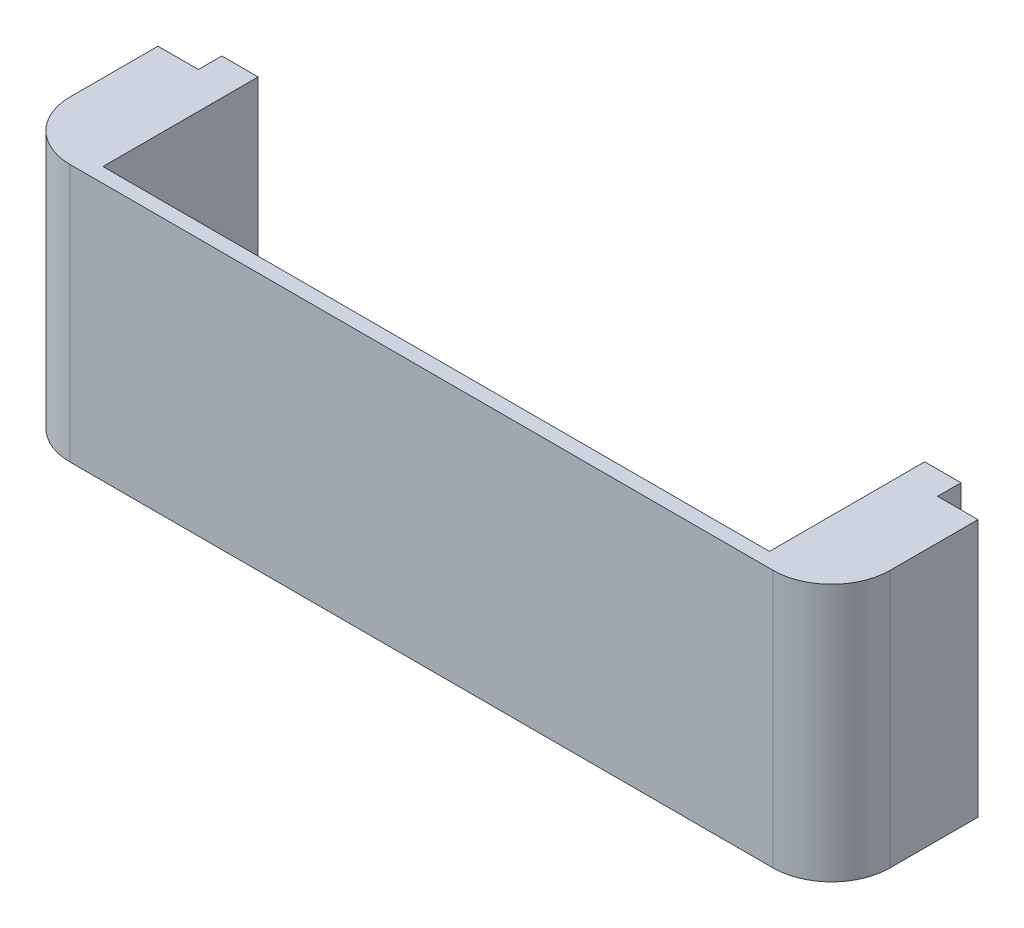
ISO-10303-21;
HEADER;
FILE_DESCRIPTION(('STEP AP214'),'2;1');
FILE_NAME('part.step','',(''),(''),'','','');
FILE_SCHEMA(('AUTOMOTIVE_DESIGN { 1 0 10303 214 1 1 1 1 }'));
ENDSEC;
DATA;
#1=APPLICATION_CONTEXT('core data for automotive mechanical design processes');
#2=APPLICATION_PROTOCOL_DEFINITION('international standard','automotive_design',2000,#1);
#3=PRODUCT_CONTEXT('',#1,'mechanical');
#4=PRODUCT('Part','Part','',(#3));
#5=PRODUCT_RELATED_PRODUCT_CATEGORY('part','',(#4));
#6=PRODUCT_DEFINITION_FORMATION('','',#4);
#7=PRODUCT_DEFINITION_CONTEXT('part definition',#1,'design');
#8=PRODUCT_DEFINITION('design','',#6,#7);
#9=PRODUCT_DEFINITION_SHAPE('','',#8);
#10=(LENGTH_UNIT() NAMED_UNIT(*) SI_UNIT(.MILLI.,.METRE.));
#11=(NAMED_UNIT(*) PLANE_ANGLE_UNIT() SI_UNIT($,.RADIAN.));
#12=(NAMED_UNIT(*) SI_UNIT($,.STERADIAN.) SOLID_ANGLE_UNIT());
#13=UNCERTAINTY_MEASURE_WITH_UNIT(LENGTH_MEASURE(1.E-05),#10,'distance_accuracy_value','');
#14=(GEOMETRIC_REPRESENTATION_CONTEXT(3) GLOBAL_UNCERTAINTY_ASSIGNED_CONTEXT((#13)) GLOBAL_UNIT_ASSIGNED_CONTEXT((#10,
#11,#12)) REPRESENTATION_CONTEXT('',''));
#15=CARTESIAN_POINT('',(0.,0.,0.));
#16=DIRECTION('',(0.,0.,1.));
#17=DIRECTION('',(1.,0.,0.));
#18=AXIS2_PLACEMENT_3D('',#15,#16,#17);
#19=CARTESIAN_POINT('',(15.,-22.,14.));
#20=DIRECTION('',(0.,-1.,0.));
#21=DIRECTION('',(1.,0.,0.));
#22=AXIS2_PLACEMENT_3D('',#19,#20,#21);
#23=PLANE('',#22);
#24=DIRECTION('',(0.,0.,-1.));
#25=VECTOR('',#24,1.);
#26=CARTESIAN_POINT('',(3.1,-22.,0.));
#27=LINE('',#26,#25);
#28=CARTESIAN_POINT('',(3.1,-22.,26.5));
#29=VERTEX_POINT('',#28);
#30=CARTESIAN_POINT('',(3.1,-22.,0.));
#31=VERTEX_POINT('',#30);
#32=EDGE_CURVE('E108',#29,#31,#27,.T.);
#33=ORIENTED_EDGE('',*,*,#32,.F.);
#34=DIRECTION('',(1.,0.,0.));
#35=VECTOR('',#34,1.);
#36=CARTESIAN_POINT('',(10.,-22.,26.5));
#37=LINE('',#36,#35);
#38=CARTESIAN_POINT('',(116.9,-22.,26.5));
#39=VERTEX_POINT('',#38);
#40=EDGE_CURVE('E207',#29,#39,#37,.T.);
#41=ORIENTED_EDGE('',*,*,#40,.T.);
#42=DIRECTION('',(0.,0.,-1.));
#43=VECTOR('',#42,1.);
#44=CARTESIAN_POINT('',(116.9,-22.,4.));
#45=LINE('',#44,#43);
#46=CARTESIAN_POINT('',(116.9,-22.,0.));
#47=VERTEX_POINT('',#46);
#48=EDGE_CURVE('E241',#39,#47,#45,.T.);
#49=ORIENTED_EDGE('',*,*,#48,.T.);
#50=DIRECTION('',(1.,0.,0.));
#51=VECTOR('',#50,1.);
#52=CARTESIAN_POINT('',(116.9,-22.,0.));
#53=LINE('',#52,#51);
#54=CARTESIAN_POINT('',(123.1,-22.,0.));
#55=VERTEX_POINT('',#54);
#56=EDGE_CURVE('E239',#47,#55,#53,.T.);
#57=ORIENTED_EDGE('',*,*,#56,.T.);
#58=DIRECTION('',(0.,0.,1.));
#59=VECTOR('',#58,1.);
#60=CARTESIAN_POINT('',(123.1,-22.,0.));
#61=LINE('',#60,#59);
#62=CARTESIAN_POINT('',(123.1,-22.,4.));
#63=VERTEX_POINT('',#62);
#64=EDGE_CURVE('E236',#55,#63,#61,.T.);
#65=ORIENTED_EDGE('',*,*,#64,.T.);
#66=DIRECTION('',(1.,0.,0.));
#67=VECTOR('',#66,1.);
#68=CARTESIAN_POINT('',(123.1,-22.,4.));
#69=LINE('',#68,#67);
#70=CARTESIAN_POINT('',(130.,-22.,4.));
#71=VERTEX_POINT('',#70);
#72=EDGE_CURVE('E233',#63,#71,#69,.T.);
#73=ORIENTED_EDGE('',*,*,#72,.T.);
#74=DIRECTION('',(0.,0.,-1.));
#75=VECTOR('',#74,1.);
#76=CARTESIAN_POINT('',(130.,-22.,19.));
#77=LINE('',#76,#75);
#78=CARTESIAN_POINT('',(130.,-22.,19.));
#79=VERTEX_POINT('',#78);
#80=EDGE_CURVE('E212',#79,#71,#77,.T.);
#81=ORIENTED_EDGE('',*,*,#80,.F.);
#82=CARTESIAN_POINT('',(120.,-22.,19.));
#83=DIRECTION('',(0.,-1.,0.));
#84=DIRECTION('',(1.,0.,0.));
#85=AXIS2_PLACEMENT_3D('',#82,#83,#84);
#86=CIRCLE('',#85,10.);
#87=CARTESIAN_POINT('',(120.,-22.,29.));
#88=VERTEX_POINT('',#87);
#89=EDGE_CURVE('E208',#79,#88,#86,.T.);
#90=ORIENTED_EDGE('',*,*,#89,.T.);
#91=DIRECTION('',(1.,0.,0.));
#92=VECTOR('',#91,1.);
#93=CARTESIAN_POINT('',(-10.,-22.,29.));
#94=LINE('',#93,#92);
#95=CARTESIAN_POINT('',(0.,-22.,29.));
#96=VERTEX_POINT('',#95);
#97=EDGE_CURVE('E265',#96,#88,#94,.T.);
#98=ORIENTED_EDGE('',*,*,#97,.F.);
#99=CARTESIAN_POINT('',(0.,-22.,19.));
#100=DIRECTION('',(0.,1.,0.));
#101=DIRECTION('',(-1.,0.,0.));
#102=AXIS2_PLACEMENT_3D('',#99,#100,#101);
#103=CIRCLE('',#102,10.);
#104=CARTESIAN_POINT('',(-10.,-22.,19.));
#105=VERTEX_POINT('',#104);
#106=EDGE_CURVE('E100',#105,#96,#103,.T.);
#107=ORIENTED_EDGE('',*,*,#106,.F.);
#108=DIRECTION('',(0.,0.,1.));
#109=VECTOR('',#108,1.);
#110=CARTESIAN_POINT('',(-10.,-22.,0.));
#111=LINE('',#110,#109);
#112=CARTESIAN_POINT('',(-10.,-22.,4.));
#113=VERTEX_POINT('',#112);
#114=EDGE_CURVE('E269',#113,#105,#111,.T.);
#115=ORIENTED_EDGE('',*,*,#114,.F.);
#116=DIRECTION('',(-1.,0.,0.));
#117=VECTOR('',#116,1.);
#118=CARTESIAN_POINT('',(0.,-22.,4.));
#119=LINE('',#118,#117);
#120=CARTESIAN_POINT('',(-3.1,-22.,4.));
#121=VERTEX_POINT('',#120);
#122=EDGE_CURVE('E277',#121,#113,#119,.T.);
#123=ORIENTED_EDGE('',*,*,#122,.F.);
#124=DIRECTION('',(0.,0.,1.));
#125=VECTOR('',#124,1.);
#126=CARTESIAN_POINT('',(-3.1,-22.,0.));
#127=LINE('',#126,#125);
#128=CARTESIAN_POINT('',(-3.1,-22.,0.));
#129=VERTEX_POINT('',#128);
#130=EDGE_CURVE('E275',#129,#121,#127,.T.);
#131=ORIENTED_EDGE('',*,*,#130,.F.);
#132=DIRECTION('',(-1.,0.,0.));
#133=VECTOR('',#132,1.);
#134=CARTESIAN_POINT('',(15.,-22.,0.));
#135=LINE('',#134,#133);
#136=EDGE_CURVE('E93',#31,#129,#135,.T.);
#137=ORIENTED_EDGE('',*,*,#136,.F.);
#138=EDGE_LOOP('',(#33,#41,#49,#57,#65,#73,#81,#90,#98,#107,#115,#123,#131,#137));
#139=FACE_BOUND('',#138,.T.);
#140=ADVANCED_FACE('F86',(#139),#23,.T.);
#141=CARTESIAN_POINT('',(0.,22.,14.));
#142=DIRECTION('',(0.,1.,0.));
#143=DIRECTION('',(0.,0.,1.));
#144=AXIS2_PLACEMENT_3D('',#141,#142,#143);
#145=PLANE('',#144);
#146=DIRECTION('',(1.,0.,0.));
#147=VECTOR('',#146,1.);
#148=CARTESIAN_POINT('',(9.99999999999999,22.,26.5));
#149=LINE('',#148,#147);
#150=CARTESIAN_POINT('',(3.1,22.,26.5));
#151=VERTEX_POINT('',#150);
#152=CARTESIAN_POINT('',(116.9,22.,26.5));
#153=VERTEX_POINT('',#152);
#154=EDGE_CURVE('E195',#151,#153,#149,.T.);
#155=ORIENTED_EDGE('',*,*,#154,.F.);
#156=DIRECTION('',(0.,0.,-1.));
#157=VECTOR('',#156,1.);
#158=CARTESIAN_POINT('',(3.1,22.,0.));
#159=LINE('',#158,#157);
#160=CARTESIAN_POINT('',(3.1,22.,0.));
#161=VERTEX_POINT('',#160);
#162=EDGE_CURVE('E184',#151,#161,#159,.T.);
#163=ORIENTED_EDGE('',*,*,#162,.T.);
#164=DIRECTION('',(1.,0.,0.));
#165=VECTOR('',#164,1.);
#166=CARTESIAN_POINT('',(0.,22.,0.));
#167=LINE('',#166,#165);
#168=CARTESIAN_POINT('',(-3.1,22.,0.));
#169=VERTEX_POINT('',#168);
#170=EDGE_CURVE('E12',#169,#161,#167,.T.);
#171=ORIENTED_EDGE('',*,*,#170,.F.);
#172=DIRECTION('',(0.,0.,1.));
#173=VECTOR('',#172,1.);
#174=CARTESIAN_POINT('',(-3.1,22.,0.));
#175=LINE('',#174,#173);
#176=CARTESIAN_POINT('',(-3.1,22.,4.));
#177=VERTEX_POINT('',#176);
#178=EDGE_CURVE('E192',#169,#177,#175,.T.);
#179=ORIENTED_EDGE('',*,*,#178,.T.);
#180=DIRECTION('',(-1.,0.,0.));
#181=VECTOR('',#180,1.);
#182=CARTESIAN_POINT('',(0.,22.,4.));
#183=LINE('',#182,#181);
#184=CARTESIAN_POINT('',(-10.,22.,4.));
#185=VERTEX_POINT('',#184);
#186=EDGE_CURVE('E278',#177,#185,#183,.T.);
#187=ORIENTED_EDGE('',*,*,#186,.T.);
#188=DIRECTION('',(0.,0.,-1.));
#189=VECTOR('',#188,1.);
#190=CARTESIAN_POINT('',(-10.,22.,14.));
#191=LINE('',#190,#189);
#192=CARTESIAN_POINT('',(-10.,22.,19.));
#193=VERTEX_POINT('',#192);
#194=EDGE_CURVE('E273',#193,#185,#191,.T.);
#195=ORIENTED_EDGE('',*,*,#194,.F.);
#196=CARTESIAN_POINT('',(0.,22.,19.));
#197=DIRECTION('',(0.,1.,0.));
#198=DIRECTION('',(-1.,0.,0.));
#199=AXIS2_PLACEMENT_3D('',#196,#197,#198);
#200=CIRCLE('',#199,10.);
#201=CARTESIAN_POINT('',(0.,22.,29.));
#202=VERTEX_POINT('',#201);
#203=EDGE_CURVE('E258',#193,#202,#200,.T.);
#204=ORIENTED_EDGE('',*,*,#203,.T.);
#205=DIRECTION('',(1.,0.,0.));
#206=VECTOR('',#205,1.);
#207=CARTESIAN_POINT('',(-10.,22.,29.));
#208=LINE('',#207,#206);
#209=CARTESIAN_POINT('',(120.,22.,29.));
#210=VERTEX_POINT('',#209);
#211=EDGE_CURVE('E267',#202,#210,#208,.T.);
#212=ORIENTED_EDGE('',*,*,#211,.T.);
#213=CARTESIAN_POINT('',(120.,22.,19.));
#214=DIRECTION('',(0.,-1.,0.));
#215=DIRECTION('',(1.,0.,0.));
#216=AXIS2_PLACEMENT_3D('',#213,#214,#215);
#217=CIRCLE('',#216,10.);
#218=CARTESIAN_POINT('',(130.,22.,19.));
#219=VERTEX_POINT('',#218);
#220=EDGE_CURVE('E216',#219,#210,#217,.T.);
#221=ORIENTED_EDGE('',*,*,#220,.F.);
#222=DIRECTION('',(0.,0.,-1.));
#223=VECTOR('',#222,1.);
#224=CARTESIAN_POINT('',(130.,22.,19.));
#225=LINE('',#224,#223);
#226=CARTESIAN_POINT('',(130.,22.,4.));
#227=VERTEX_POINT('',#226);
#228=EDGE_CURVE('E219',#219,#227,#225,.T.);
#229=ORIENTED_EDGE('',*,*,#228,.T.);
#230=DIRECTION('',(1.,0.,0.));
#231=VECTOR('',#230,1.);
#232=CARTESIAN_POINT('',(123.1,22.,4.));
#233=LINE('',#232,#231);
#234=CARTESIAN_POINT('',(123.1,22.,4.));
#235=VERTEX_POINT('',#234);
#236=EDGE_CURVE('E221',#235,#227,#233,.T.);
#237=ORIENTED_EDGE('',*,*,#236,.F.);
#238=DIRECTION('',(0.,0.,1.));
#239=VECTOR('',#238,1.);
#240=CARTESIAN_POINT('',(123.1,22.,0.));
#241=LINE('',#240,#239);
#242=CARTESIAN_POINT('',(123.1,22.,0.));
#243=VERTEX_POINT('',#242);
#244=EDGE_CURVE('E224',#243,#235,#241,.T.);
#245=ORIENTED_EDGE('',*,*,#244,.F.);
#246=DIRECTION('',(1.,0.,0.));
#247=VECTOR('',#246,1.);
#248=CARTESIAN_POINT('',(120.,22.,0.));
#249=LINE('',#248,#247);
#250=CARTESIAN_POINT('',(116.9,22.,0.));
#251=VERTEX_POINT('',#250);
#252=EDGE_CURVE('E227',#251,#243,#249,.T.);
#253=ORIENTED_EDGE('',*,*,#252,.F.);
#254=DIRECTION('',(0.,0.,-1.));
#255=VECTOR('',#254,1.);
#256=CARTESIAN_POINT('',(116.9,22.,4.));
#257=LINE('',#256,#255);
#258=EDGE_CURVE('E198',#153,#251,#257,.T.);
#259=ORIENTED_EDGE('',*,*,#258,.F.);
#260=EDGE_LOOP('',(#155,#163,#171,#179,#187,#195,#204,#212,#221,#229,#237,#245,#253,#259));
#261=FACE_BOUND('',#260,.T.);
#262=ADVANCED_FACE('F196',(#261),#145,.T.);
#263=CARTESIAN_POINT('',(-10.,22.,29.));
#264=DIRECTION('',(0.,0.,-1.));
#265=DIRECTION('',(-1.,0.,0.));
#266=AXIS2_PLACEMENT_3D('',#263,#264,#265);
#267=PLANE('',#266);
#268=DIRECTION('',(0.,-1.,0.));
#269=VECTOR('',#268,1.);
#270=CARTESIAN_POINT('',(0.,22.,29.));
#271=LINE('',#270,#269);
#272=EDGE_CURVE('E263',#202,#96,#271,.T.);
#273=ORIENTED_EDGE('',*,*,#272,.T.);
#274=ORIENTED_EDGE('',*,*,#97,.T.);
#275=DIRECTION('',(0.,-1.,0.));
#276=VECTOR('',#275,1.);
#277=CARTESIAN_POINT('',(120.,22.,29.));
#278=LINE('',#277,#276);
#279=EDGE_CURVE('E255',#210,#88,#278,.T.);
#280=ORIENTED_EDGE('',*,*,#279,.F.);
#281=ORIENTED_EDGE('',*,*,#211,.F.);
#282=EDGE_LOOP('',(#273,#274,#280,#281));
#283=FACE_BOUND('',#282,.T.);
#284=ADVANCED_FACE('F319',(#283),#267,.F.);
#285=CARTESIAN_POINT('',(0.,-22.,4.));
#286=DIRECTION('',(0.,0.,-1.));
#287=DIRECTION('',(-1.,0.,0.));
#288=AXIS2_PLACEMENT_3D('',#285,#286,#287);
#289=PLANE('',#288);
#290=ORIENTED_EDGE('',*,*,#186,.F.);
#291=DIRECTION('',(0.,1.,0.));
#292=VECTOR('',#291,1.);
#293=CARTESIAN_POINT('',(-3.1,-22.,4.));
#294=LINE('',#293,#292);
#295=EDGE_CURVE('E286',#121,#177,#294,.T.);
#296=ORIENTED_EDGE('',*,*,#295,.F.);
#297=ORIENTED_EDGE('',*,*,#122,.T.);
#298=DIRECTION('',(0.,1.,0.));
#299=VECTOR('',#298,1.);
#300=CARTESIAN_POINT('',(-10.,-22.,4.));
#301=LINE('',#300,#299);
#302=EDGE_CURVE('E288',#113,#185,#301,.T.);
#303=ORIENTED_EDGE('',*,*,#302,.T.);
#304=EDGE_LOOP('',(#290,#296,#297,#303));
#305=FACE_BOUND('',#304,.T.);
#306=ADVANCED_FACE('F307',(#305),#289,.T.);
#307=CARTESIAN_POINT('',(0.,0.,0.));
#308=DIRECTION('',(0.,0.,1.));
#309=DIRECTION('',(1.,0.,0.));
#310=AXIS2_PLACEMENT_3D('',#307,#308,#309);
#311=PLANE('',#310);
#312=DIRECTION('',(0.,1.,0.));
#313=VECTOR('',#312,1.);
#314=CARTESIAN_POINT('',(-3.1,-22.,0.));
#315=LINE('',#314,#313);
#316=EDGE_CURVE('E281',#129,#169,#315,.T.);
#317=ORIENTED_EDGE('',*,*,#316,.T.);
#318=ORIENTED_EDGE('',*,*,#170,.T.);
#319=DIRECTION('',(0.,1.,0.));
#320=VECTOR('',#319,1.);
#321=CARTESIAN_POINT('',(3.1,-22.,0.));
#322=LINE('',#321,#320);
#323=EDGE_CURVE('E189',#31,#161,#322,.T.);
#324=ORIENTED_EDGE('',*,*,#323,.F.);
#325=ORIENTED_EDGE('',*,*,#136,.T.);
#326=EDGE_LOOP('',(#317,#318,#324,#325));
#327=FACE_BOUND('',#326,.T.);
#328=ADVANCED_FACE('F296',(#327),#311,.F.);
#329=CARTESIAN_POINT('',(3.1,-22.,0.));
#330=DIRECTION('',(1.,0.,0.));
#331=DIRECTION('',(0.,0.,-1.));
#332=AXIS2_PLACEMENT_3D('',#329,#330,#331);
#333=PLANE('',#332);
#334=ORIENTED_EDGE('',*,*,#323,.T.);
#335=ORIENTED_EDGE('',*,*,#162,.F.);
#336=DIRECTION('',(0.,1.,0.));
#337=VECTOR('',#336,1.);
#338=CARTESIAN_POINT('',(3.1,-28.,26.5));
#339=LINE('',#338,#337);
#340=EDGE_CURVE('E188',#29,#151,#339,.T.);
#341=ORIENTED_EDGE('',*,*,#340,.F.);
#342=ORIENTED_EDGE('',*,*,#32,.T.);
#343=EDGE_LOOP('',(#334,#335,#341,#342));
#344=FACE_BOUND('',#343,.T.);
#345=ADVANCED_FACE('F186',(#344),#333,.T.);
#346=CARTESIAN_POINT('',(-3.1,-22.,0.));
#347=DIRECTION('',(-1.,0.,0.));
#348=DIRECTION('',(0.,0.,1.));
#349=AXIS2_PLACEMENT_3D('',#346,#347,#348);
#350=PLANE('',#349);
#351=ORIENTED_EDGE('',*,*,#295,.T.);
#352=ORIENTED_EDGE('',*,*,#178,.F.);
#353=ORIENTED_EDGE('',*,*,#316,.F.);
#354=ORIENTED_EDGE('',*,*,#130,.T.);
#355=EDGE_LOOP('',(#351,#352,#353,#354));
#356=FACE_BOUND('',#355,.T.);
#357=ADVANCED_FACE('F304',(#356),#350,.T.);
#358=CARTESIAN_POINT('',(-10.,28.,0.));
#359=DIRECTION('',(1.,0.,0.));
#360=DIRECTION('',(0.,1.,0.));
#361=AXIS2_PLACEMENT_3D('',#358,#359,#360);
#362=PLANE('',#361);
#363=ORIENTED_EDGE('',*,*,#114,.T.);
#364=DIRECTION('',(0.,-1.,0.));
#365=VECTOR('',#364,1.);
#366=CARTESIAN_POINT('',(-10.,22.,19.));
#367=LINE('',#366,#365);
#368=EDGE_CURVE('E261',#193,#105,#367,.T.);
#369=ORIENTED_EDGE('',*,*,#368,.F.);
#370=ORIENTED_EDGE('',*,*,#194,.T.);
#371=ORIENTED_EDGE('',*,*,#302,.F.);
#372=EDGE_LOOP('',(#363,#369,#370,#371));
#373=FACE_BOUND('',#372,.T.);
#374=ADVANCED_FACE('F312',(#373),#362,.F.);
#375=CARTESIAN_POINT('',(0.,22.,19.));
#376=DIRECTION('',(0.,-1.,0.));
#377=DIRECTION('',(1.,0.,0.));
#378=AXIS2_PLACEMENT_3D('',#375,#376,#377);
#379=CYLINDRICAL_SURFACE('',#378,10.);
#380=ORIENTED_EDGE('',*,*,#106,.T.);
#381=ORIENTED_EDGE('',*,*,#272,.F.);
#382=ORIENTED_EDGE('',*,*,#203,.F.);
#383=ORIENTED_EDGE('',*,*,#368,.T.);
#384=EDGE_LOOP('',(#380,#381,#382,#383));
#385=FACE_BOUND('',#384,.T.);
#386=ADVANCED_FACE('F313',(#385),#379,.T.);
#387=CARTESIAN_POINT('',(120.,22.,19.));
#388=DIRECTION('',(0.,-1.,0.));
#389=DIRECTION('',(1.,0.,0.));
#390=AXIS2_PLACEMENT_3D('',#387,#388,#389);
#391=CYLINDRICAL_SURFACE('',#390,10.);
#392=ORIENTED_EDGE('',*,*,#89,.F.);
#393=DIRECTION('',(0.,-1.,0.));
#394=VECTOR('',#393,1.);
#395=CARTESIAN_POINT('',(130.,22.,19.));
#396=LINE('',#395,#394);
#397=EDGE_CURVE('E253',#219,#79,#396,.T.);
#398=ORIENTED_EDGE('',*,*,#397,.F.);
#399=ORIENTED_EDGE('',*,*,#220,.T.);
#400=ORIENTED_EDGE('',*,*,#279,.T.);
#401=EDGE_LOOP('',(#392,#398,#399,#400));
#402=FACE_BOUND('',#401,.T.);
#403=ADVANCED_FACE('F321',(#402),#391,.T.);
#404=CARTESIAN_POINT('',(130.,22.,19.));
#405=DIRECTION('',(-1.,0.,0.));
#406=DIRECTION('',(0.,-1.,0.));
#407=AXIS2_PLACEMENT_3D('',#404,#405,#406);
#408=PLANE('',#407);
#409=ORIENTED_EDGE('',*,*,#80,.T.);
#410=DIRECTION('',(0.,-1.,0.));
#411=VECTOR('',#410,1.);
#412=CARTESIAN_POINT('',(130.,22.,4.));
#413=LINE('',#412,#411);
#414=EDGE_CURVE('E251',#227,#71,#413,.T.);
#415=ORIENTED_EDGE('',*,*,#414,.F.);
#416=ORIENTED_EDGE('',*,*,#228,.F.);
#417=ORIENTED_EDGE('',*,*,#397,.T.);
#418=EDGE_LOOP('',(#409,#415,#416,#417));
#419=FACE_BOUND('',#418,.T.);
#420=ADVANCED_FACE('F328',(#419),#408,.F.);
#421=CARTESIAN_POINT('',(123.1,22.,4.));
#422=DIRECTION('',(0.,0.,-1.));
#423=DIRECTION('',(-1.,0.,0.));
#424=AXIS2_PLACEMENT_3D('',#421,#422,#423);
#425=PLANE('',#424);
#426=ORIENTED_EDGE('',*,*,#72,.F.);
#427=DIRECTION('',(0.,-1.,0.));
#428=VECTOR('',#427,1.);
#429=CARTESIAN_POINT('',(123.1,22.,4.));
#430=LINE('',#429,#428);
#431=EDGE_CURVE('E249',#235,#63,#430,.T.);
#432=ORIENTED_EDGE('',*,*,#431,.F.);
#433=ORIENTED_EDGE('',*,*,#236,.T.);
#434=ORIENTED_EDGE('',*,*,#414,.T.);
#435=EDGE_LOOP('',(#426,#432,#433,#434));
#436=FACE_BOUND('',#435,.T.);
#437=ADVANCED_FACE('F331',(#436),#425,.T.);
#438=CARTESIAN_POINT('',(123.1,22.,0.));
#439=DIRECTION('',(1.,0.,0.));
#440=DIRECTION('',(0.,1.,0.));
#441=AXIS2_PLACEMENT_3D('',#438,#439,#440);
#442=PLANE('',#441);
#443=ORIENTED_EDGE('',*,*,#64,.F.);
#444=DIRECTION('',(0.,-1.,0.));
#445=VECTOR('',#444,1.);
#446=CARTESIAN_POINT('',(123.1,22.,0.));
#447=LINE('',#446,#445);
#448=EDGE_CURVE('E246',#243,#55,#447,.T.);
#449=ORIENTED_EDGE('',*,*,#448,.F.);
#450=ORIENTED_EDGE('',*,*,#244,.T.);
#451=ORIENTED_EDGE('',*,*,#431,.T.);
#452=EDGE_LOOP('',(#443,#449,#450,#451));
#453=FACE_BOUND('',#452,.T.);
#454=ADVANCED_FACE('F334',(#453),#442,.T.);
#455=CARTESIAN_POINT('',(116.9,22.,0.));
#456=DIRECTION('',(0.,0.,-1.));
#457=DIRECTION('',(-1.,0.,0.));
#458=AXIS2_PLACEMENT_3D('',#455,#456,#457);
#459=PLANE('',#458);
#460=ORIENTED_EDGE('',*,*,#56,.F.);
#461=DIRECTION('',(0.,-1.,0.));
#462=VECTOR('',#461,1.);
#463=CARTESIAN_POINT('',(116.9,22.,0.));
#464=LINE('',#463,#462);
#465=EDGE_CURVE('E202',#251,#47,#464,.T.);
#466=ORIENTED_EDGE('',*,*,#465,.F.);
#467=ORIENTED_EDGE('',*,*,#252,.T.);
#468=ORIENTED_EDGE('',*,*,#448,.T.);
#469=EDGE_LOOP('',(#460,#466,#467,#468));
#470=FACE_BOUND('',#469,.T.);
#471=ADVANCED_FACE('F338',(#470),#459,.T.);
#472=CARTESIAN_POINT('',(116.9,22.,4.));
#473=DIRECTION('',(-1.,0.,0.));
#474=DIRECTION('',(0.,-1.,0.));
#475=AXIS2_PLACEMENT_3D('',#472,#473,#474);
#476=PLANE('',#475);
#477=ORIENTED_EDGE('',*,*,#48,.F.);
#478=DIRECTION('',(0.,1.,0.));
#479=VECTOR('',#478,1.);
#480=CARTESIAN_POINT('',(116.9,-28.,26.5));
#481=LINE('',#480,#479);
#482=EDGE_CURVE('E209',#39,#153,#481,.T.);
#483=ORIENTED_EDGE('',*,*,#482,.T.);
#484=ORIENTED_EDGE('',*,*,#258,.T.);
#485=ORIENTED_EDGE('',*,*,#465,.T.);
#486=EDGE_LOOP('',(#477,#483,#484,#485));
#487=FACE_BOUND('',#486,.T.);
#488=ADVANCED_FACE('F340',(#487),#476,.T.);
#489=CARTESIAN_POINT('',(9.99999999999999,22.,26.5));
#490=DIRECTION('',(0.,0.,-1.));
#491=DIRECTION('',(-1.,0.,0.));
#492=AXIS2_PLACEMENT_3D('',#489,#490,#491);
#493=PLANE('',#492);
#494=ORIENTED_EDGE('',*,*,#40,.F.);
#495=ORIENTED_EDGE('',*,*,#340,.T.);
#496=ORIENTED_EDGE('',*,*,#154,.T.);
#497=ORIENTED_EDGE('',*,*,#482,.F.);
#498=EDGE_LOOP('',(#494,#495,#496,#497));
#499=FACE_BOUND('',#498,.T.);
#500=ADVANCED_FACE('F205',(#499),#493,.T.);
#501=CLOSED_SHELL('',(#140,#262,#284,#306,#328,#345,#357,#374,#386,#403,#420,#437,#454,#471,
#488,#500));
#502=MANIFOLD_SOLID_BREP('B2',#501);
#503=ADVANCED_BREP_SHAPE_REPRESENTATION('',(#18,#502),#14);
#504=SHAPE_DEFINITION_REPRESENTATION(#9,#503);
ENDSEC;
END-ISO-10303-21;
